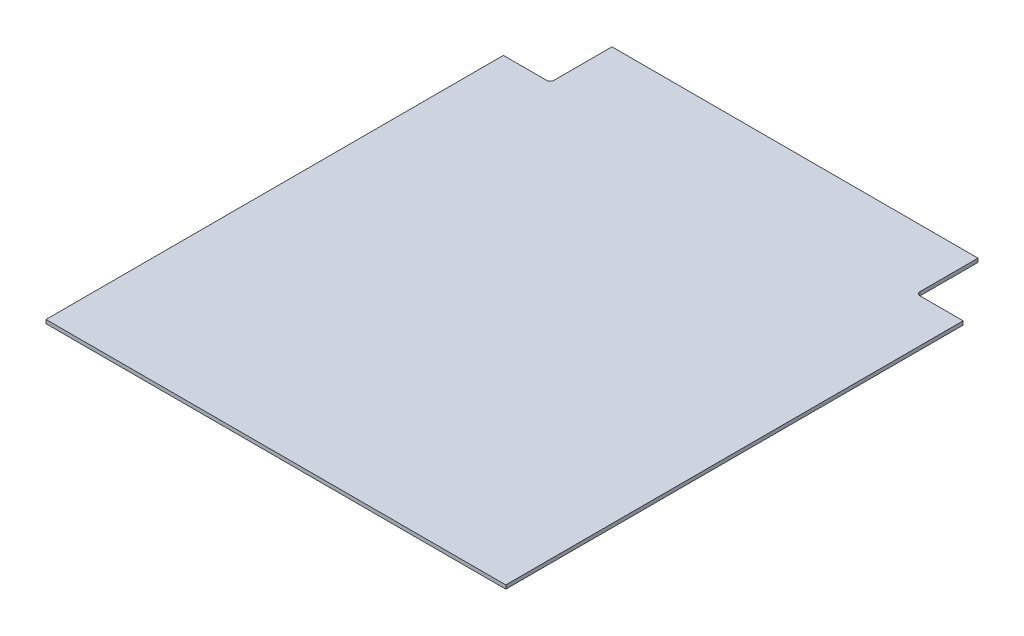
ISO-10303-21;
HEADER;
FILE_DESCRIPTION(('STEP AP214'),'2;1');
FILE_NAME('part.step','',(''),(''),'','','');
FILE_SCHEMA(('AUTOMOTIVE_DESIGN { 1 0 10303 214 1 1 1 1 }'));
ENDSEC;
DATA;
#1=APPLICATION_CONTEXT('core data for automotive mechanical design processes');
#2=APPLICATION_PROTOCOL_DEFINITION('international standard','automotive_design',2000,#1);
#3=PRODUCT_CONTEXT('',#1,'mechanical');
#4=PRODUCT('Part','Part','',(#3));
#5=PRODUCT_RELATED_PRODUCT_CATEGORY('part','',(#4));
#6=PRODUCT_DEFINITION_FORMATION('','',#4);
#7=PRODUCT_DEFINITION_CONTEXT('part definition',#1,'design');
#8=PRODUCT_DEFINITION('design','',#6,#7);
#9=PRODUCT_DEFINITION_SHAPE('','',#8);
#10=(LENGTH_UNIT() NAMED_UNIT(*) SI_UNIT(.MILLI.,.METRE.));
#11=(NAMED_UNIT(*) PLANE_ANGLE_UNIT() SI_UNIT($,.RADIAN.));
#12=(NAMED_UNIT(*) SI_UNIT($,.STERADIAN.) SOLID_ANGLE_UNIT());
#13=UNCERTAINTY_MEASURE_WITH_UNIT(LENGTH_MEASURE(1.E-05),#10,'distance_accuracy_value','');
#14=(GEOMETRIC_REPRESENTATION_CONTEXT(3) GLOBAL_UNCERTAINTY_ASSIGNED_CONTEXT((#13)) GLOBAL_UNIT_ASSIGNED_CONTEXT((#10,
#11,#12)) REPRESENTATION_CONTEXT('',''));
#15=CARTESIAN_POINT('',(0.,0.,0.));
#16=DIRECTION('',(0.,0.,1.));
#17=DIRECTION('',(1.,0.,0.));
#18=AXIS2_PLACEMENT_3D('',#15,#16,#17);
#19=CARTESIAN_POINT('',(-196.85,3.175,222.25));
#20=DIRECTION('',(1.,0.,0.));
#21=DIRECTION('',(0.,0.,-1.));
#22=AXIS2_PLACEMENT_3D('',#19,#20,#21);
#23=PLANE('',#22);
#24=DIRECTION('',(0.,0.,1.));
#25=VECTOR('',#24,1.);
#26=CARTESIAN_POINT('',(-196.85,3.175,222.25));
#27=LINE('',#26,#25);
#28=CARTESIAN_POINT('',(-196.85,3.175,-169.418));
#29=VERTEX_POINT('',#28);
#30=CARTESIAN_POINT('',(-196.85,3.175,222.25));
#31=VERTEX_POINT('',#30);
#32=EDGE_CURVE('E124',#29,#31,#27,.T.);
#33=ORIENTED_EDGE('',*,*,#32,.F.);
#34=DIRECTION('',(0.,1.,0.));
#35=VECTOR('',#34,1.);
#36=CARTESIAN_POINT('',(-196.85,-6.825,-169.418));
#37=LINE('',#36,#35);
#38=CARTESIAN_POINT('',(-196.85,0.,-169.418));
#39=VERTEX_POINT('',#38);
#40=EDGE_CURVE('E109',#39,#29,#37,.T.);
#41=ORIENTED_EDGE('',*,*,#40,.F.);
#42=DIRECTION('',(0.,0.,1.));
#43=VECTOR('',#42,1.);
#44=CARTESIAN_POINT('',(-196.85,0.,222.25));
#45=LINE('',#44,#43);
#46=CARTESIAN_POINT('',(-196.85,0.,222.25));
#47=VERTEX_POINT('',#46);
#48=EDGE_CURVE('E151',#39,#47,#45,.T.);
#49=ORIENTED_EDGE('',*,*,#48,.T.);
#50=DIRECTION('',(0.,-1.,0.));
#51=VECTOR('',#50,1.);
#52=CARTESIAN_POINT('',(-196.85,3.175,222.25));
#53=LINE('',#52,#51);
#54=EDGE_CURVE('E132',#31,#47,#53,.T.);
#55=ORIENTED_EDGE('',*,*,#54,.F.);
#56=EDGE_LOOP('',(#33,#41,#49,#55));
#57=FACE_BOUND('',#56,.T.);
#58=ADVANCED_FACE('F35',(#57),#23,.F.);
#59=CARTESIAN_POINT('',(196.85,3.175,222.25));
#60=DIRECTION('',(0.,0.,-1.));
#61=DIRECTION('',(-1.,0.,0.));
#62=AXIS2_PLACEMENT_3D('',#59,#60,#61);
#63=PLANE('',#62);
#64=DIRECTION('',(1.,0.,0.));
#65=VECTOR('',#64,1.);
#66=CARTESIAN_POINT('',(196.85,0.,222.25));
#67=LINE('',#66,#65);
#68=CARTESIAN_POINT('',(196.85,0.,222.25));
#69=VERTEX_POINT('',#68);
#70=EDGE_CURVE('E153',#47,#69,#67,.T.);
#71=ORIENTED_EDGE('',*,*,#70,.T.);
#72=DIRECTION('',(0.,-1.,0.));
#73=VECTOR('',#72,1.);
#74=CARTESIAN_POINT('',(196.85,3.175,222.25));
#75=LINE('',#74,#73);
#76=CARTESIAN_POINT('',(196.85,3.175,222.25));
#77=VERTEX_POINT('',#76);
#78=EDGE_CURVE('E150',#77,#69,#75,.T.);
#79=ORIENTED_EDGE('',*,*,#78,.F.);
#80=DIRECTION('',(1.,0.,0.));
#81=VECTOR('',#80,1.);
#82=CARTESIAN_POINT('',(196.85,3.175,222.25));
#83=LINE('',#82,#81);
#84=EDGE_CURVE('E133',#31,#77,#83,.T.);
#85=ORIENTED_EDGE('',*,*,#84,.F.);
#86=ORIENTED_EDGE('',*,*,#54,.T.);
#87=EDGE_LOOP('',(#71,#79,#85,#86));
#88=FACE_BOUND('',#87,.T.);
#89=ADVANCED_FACE('F216',(#88),#63,.F.);
#90=CARTESIAN_POINT('',(196.85,3.175,222.25));
#91=DIRECTION('',(-1.,0.,0.));
#92=DIRECTION('',(0.,0.,1.));
#93=AXIS2_PLACEMENT_3D('',#90,#91,#92);
#94=PLANE('',#93);
#95=DIRECTION('',(0.,0.,-1.));
#96=VECTOR('',#95,1.);
#97=CARTESIAN_POINT('',(196.85,0.,222.25));
#98=LINE('',#97,#96);
#99=CARTESIAN_POINT('',(196.85,0.,-169.418));
#100=VERTEX_POINT('',#99);
#101=EDGE_CURVE('E139',#69,#100,#98,.T.);
#102=ORIENTED_EDGE('',*,*,#101,.T.);
#103=DIRECTION('',(0.,1.,0.));
#104=VECTOR('',#103,1.);
#105=CARTESIAN_POINT('',(196.85,-6.825,-169.418));
#106=LINE('',#105,#104);
#107=CARTESIAN_POINT('',(196.85,3.175,-169.418));
#108=VERTEX_POINT('',#107);
#109=EDGE_CURVE('E128',#100,#108,#106,.T.);
#110=ORIENTED_EDGE('',*,*,#109,.T.);
#111=DIRECTION('',(0.,0.,-1.));
#112=VECTOR('',#111,1.);
#113=CARTESIAN_POINT('',(196.85,3.175,222.25));
#114=LINE('',#113,#112);
#115=EDGE_CURVE('E136',#77,#108,#114,.T.);
#116=ORIENTED_EDGE('',*,*,#115,.F.);
#117=ORIENTED_EDGE('',*,*,#78,.T.);
#118=EDGE_LOOP('',(#102,#110,#116,#117));
#119=FACE_BOUND('',#118,.T.);
#120=ADVANCED_FACE('F220',(#119),#94,.F.);
#121=CARTESIAN_POINT('',(196.85,3.175,-222.25));
#122=DIRECTION('',(0.,0.,1.));
#123=DIRECTION('',(1.,0.,0.));
#124=AXIS2_PLACEMENT_3D('',#121,#122,#123);
#125=PLANE('',#124);
#126=DIRECTION('',(-1.,0.,0.));
#127=VECTOR('',#126,1.);
#128=CARTESIAN_POINT('',(196.85,0.,-222.25));
#129=LINE('',#128,#127);
#130=CARTESIAN_POINT('',(156.718,0.,-222.25));
#131=VERTEX_POINT('',#130);
#132=CARTESIAN_POINT('',(-156.718,0.,-222.25));
#133=VERTEX_POINT('',#132);
#134=EDGE_CURVE('E134',#131,#133,#129,.T.);
#135=ORIENTED_EDGE('',*,*,#134,.T.);
#136=DIRECTION('',(0.,1.,0.));
#137=VECTOR('',#136,1.);
#138=CARTESIAN_POINT('',(-156.718,-6.825,-222.25));
#139=LINE('',#138,#137);
#140=CARTESIAN_POINT('',(-156.718,3.175,-222.25));
#141=VERTEX_POINT('',#140);
#142=EDGE_CURVE('E154',#133,#141,#139,.T.);
#143=ORIENTED_EDGE('',*,*,#142,.T.);
#144=DIRECTION('',(-1.,0.,0.));
#145=VECTOR('',#144,1.);
#146=CARTESIAN_POINT('',(196.85,3.175,-222.25));
#147=LINE('',#146,#145);
#148=CARTESIAN_POINT('',(156.718,3.175,-222.25));
#149=VERTEX_POINT('',#148);
#150=EDGE_CURVE('E147',#149,#141,#147,.T.);
#151=ORIENTED_EDGE('',*,*,#150,.F.);
#152=DIRECTION('',(0.,1.,0.));
#153=VECTOR('',#152,1.);
#154=CARTESIAN_POINT('',(156.718,-6.825,-222.25));
#155=LINE('',#154,#153);
#156=EDGE_CURVE('E142',#131,#149,#155,.T.);
#157=ORIENTED_EDGE('',*,*,#156,.F.);
#158=EDGE_LOOP('',(#135,#143,#151,#157));
#159=FACE_BOUND('',#158,.T.);
#160=ADVANCED_FACE('F203',(#159),#125,.F.);
#161=CARTESIAN_POINT('',(0.,3.175,0.));
#162=DIRECTION('',(0.,1.,0.));
#163=DIRECTION('',(0.,0.,1.));
#164=AXIS2_PLACEMENT_3D('',#161,#162,#163);
#165=PLANE('',#164);
#166=DIRECTION('',(0.,0.,-1.));
#167=VECTOR('',#166,1.);
#168=CARTESIAN_POINT('',(-156.718,3.175,-222.25));
#169=LINE('',#168,#167);
#170=CARTESIAN_POINT('',(-156.718,3.175,-172.593));
#171=VERTEX_POINT('',#170);
#172=EDGE_CURVE('E119',#171,#141,#169,.T.);
#173=ORIENTED_EDGE('',*,*,#172,.F.);
#174=CARTESIAN_POINT('',(-159.893,3.175,-172.593));
#175=DIRECTION('',(0.,1.,0.));
#176=DIRECTION('',(0.,0.,-1.));
#177=AXIS2_PLACEMENT_3D('',#174,#175,#176);
#178=CIRCLE('',#177,3.17500000000003);
#179=CARTESIAN_POINT('',(-159.893,3.175,-169.418));
#180=VERTEX_POINT('',#179);
#181=EDGE_CURVE('E127',#180,#171,#178,.T.);
#182=ORIENTED_EDGE('',*,*,#181,.F.);
#183=DIRECTION('',(1.,0.,0.));
#184=VECTOR('',#183,1.);
#185=CARTESIAN_POINT('',(-196.85,3.175,-169.418));
#186=LINE('',#185,#184);
#187=EDGE_CURVE('E112',#29,#180,#186,.T.);
#188=ORIENTED_EDGE('',*,*,#187,.F.);
#189=ORIENTED_EDGE('',*,*,#32,.T.);
#190=ORIENTED_EDGE('',*,*,#84,.T.);
#191=ORIENTED_EDGE('',*,*,#115,.T.);
#192=DIRECTION('',(1.,0.,0.));
#193=VECTOR('',#192,1.);
#194=CARTESIAN_POINT('',(196.85,3.175,-169.418));
#195=LINE('',#194,#193);
#196=CARTESIAN_POINT('',(159.893,3.175,-169.418));
#197=VERTEX_POINT('',#196);
#198=EDGE_CURVE('E190',#197,#108,#195,.T.);
#199=ORIENTED_EDGE('',*,*,#198,.F.);
#200=CARTESIAN_POINT('',(159.893,3.175,-172.593));
#201=DIRECTION('',(0.,1.,0.));
#202=DIRECTION('',(0.,0.,1.));
#203=AXIS2_PLACEMENT_3D('',#200,#201,#202);
#204=CIRCLE('',#203,3.175);
#205=CARTESIAN_POINT('',(156.718,3.175,-172.593));
#206=VERTEX_POINT('',#205);
#207=EDGE_CURVE('E187',#206,#197,#204,.T.);
#208=ORIENTED_EDGE('',*,*,#207,.F.);
#209=DIRECTION('',(0.,0.,1.));
#210=VECTOR('',#209,1.);
#211=CARTESIAN_POINT('',(156.718,3.175,-222.25));
#212=LINE('',#211,#210);
#213=EDGE_CURVE('E185',#149,#206,#212,.T.);
#214=ORIENTED_EDGE('',*,*,#213,.F.);
#215=ORIENTED_EDGE('',*,*,#150,.T.);
#216=EDGE_LOOP('',(#173,#182,#188,#189,#190,#191,#199,#208,#214,#215));
#217=FACE_BOUND('',#216,.T.);
#218=ADVANCED_FACE('F123',(#217),#165,.T.);
#219=CARTESIAN_POINT('',(0.,0.,0.));
#220=DIRECTION('',(0.,1.,0.));
#221=DIRECTION('',(0.,0.,1.));
#222=AXIS2_PLACEMENT_3D('',#219,#220,#221);
#223=PLANE('',#222);
#224=CARTESIAN_POINT('',(-159.893,0.,-172.593));
#225=DIRECTION('',(0.,1.,0.));
#226=DIRECTION('',(0.,0.,1.));
#227=AXIS2_PLACEMENT_3D('',#224,#225,#226);
#228=CIRCLE('',#227,3.17500000000003);
#229=CARTESIAN_POINT('',(-159.893,0.,-169.418));
#230=VERTEX_POINT('',#229);
#231=CARTESIAN_POINT('',(-156.718,0.,-172.593));
#232=VERTEX_POINT('',#231);
#233=EDGE_CURVE('E42',#230,#232,#228,.T.);
#234=ORIENTED_EDGE('',*,*,#233,.T.);
#235=DIRECTION('',(0.,0.,-1.));
#236=VECTOR('',#235,1.);
#237=CARTESIAN_POINT('',(-156.718,0.,0.));
#238=LINE('',#237,#236);
#239=EDGE_CURVE('E11',#232,#133,#238,.T.);
#240=ORIENTED_EDGE('',*,*,#239,.T.);
#241=ORIENTED_EDGE('',*,*,#134,.F.);
#242=DIRECTION('',(0.,0.,1.));
#243=VECTOR('',#242,1.);
#244=CARTESIAN_POINT('',(156.718,0.,0.));
#245=LINE('',#244,#243);
#246=CARTESIAN_POINT('',(156.718,0.,-172.593));
#247=VERTEX_POINT('',#246);
#248=EDGE_CURVE('E161',#131,#247,#245,.T.);
#249=ORIENTED_EDGE('',*,*,#248,.T.);
#250=CARTESIAN_POINT('',(159.893,0.,-172.593));
#251=DIRECTION('',(0.,1.,0.));
#252=DIRECTION('',(0.,0.,1.));
#253=AXIS2_PLACEMENT_3D('',#250,#251,#252);
#254=CIRCLE('',#253,3.175);
#255=CARTESIAN_POINT('',(159.893,0.,-169.418));
#256=VERTEX_POINT('',#255);
#257=EDGE_CURVE('E164',#247,#256,#254,.T.);
#258=ORIENTED_EDGE('',*,*,#257,.T.);
#259=DIRECTION('',(1.,0.,0.));
#260=VECTOR('',#259,1.);
#261=CARTESIAN_POINT('',(0.,0.,-169.418));
#262=LINE('',#261,#260);
#263=EDGE_CURVE('E167',#256,#100,#262,.T.);
#264=ORIENTED_EDGE('',*,*,#263,.T.);
#265=ORIENTED_EDGE('',*,*,#101,.F.);
#266=ORIENTED_EDGE('',*,*,#70,.F.);
#267=ORIENTED_EDGE('',*,*,#48,.F.);
#268=DIRECTION('',(1.,0.,0.));
#269=VECTOR('',#268,1.);
#270=CARTESIAN_POINT('',(0.,0.,-169.418));
#271=LINE('',#270,#269);
#272=EDGE_CURVE('E115',#39,#230,#271,.T.);
#273=ORIENTED_EDGE('',*,*,#272,.T.);
#274=EDGE_LOOP('',(#234,#240,#241,#249,#258,#264,#265,#266,#267,#273));
#275=FACE_BOUND('',#274,.T.);
#276=ADVANCED_FACE('F172',(#275),#223,.F.);
#277=CARTESIAN_POINT('',(196.85,-6.825,-169.418));
#278=DIRECTION('',(0.,0.,1.));
#279=DIRECTION('',(1.,0.,0.));
#280=AXIS2_PLACEMENT_3D('',#277,#278,#279);
#281=PLANE('',#280);
#282=DIRECTION('',(0.,1.,0.));
#283=VECTOR('',#282,1.);
#284=CARTESIAN_POINT('',(159.893,-6.825,-169.418));
#285=LINE('',#284,#283);
#286=EDGE_CURVE('E194',#256,#197,#285,.T.);
#287=ORIENTED_EDGE('',*,*,#286,.T.);
#288=ORIENTED_EDGE('',*,*,#198,.T.);
#289=ORIENTED_EDGE('',*,*,#109,.F.);
#290=ORIENTED_EDGE('',*,*,#263,.F.);
#291=EDGE_LOOP('',(#287,#288,#289,#290));
#292=FACE_BOUND('',#291,.T.);
#293=ADVANCED_FACE('F232',(#292),#281,.F.);
#294=CARTESIAN_POINT('',(159.893,-6.825,-172.593));
#295=DIRECTION('',(0.,1.,0.));
#296=DIRECTION('',(0.,0.,1.));
#297=AXIS2_PLACEMENT_3D('',#294,#295,#296);
#298=CYLINDRICAL_SURFACE('',#297,3.175);
#299=DIRECTION('',(0.,1.,0.));
#300=VECTOR('',#299,1.);
#301=CARTESIAN_POINT('',(156.718,-6.825,-172.593));
#302=LINE('',#301,#300);
#303=EDGE_CURVE('E57',#247,#206,#302,.T.);
#304=ORIENTED_EDGE('',*,*,#303,.T.);
#305=ORIENTED_EDGE('',*,*,#207,.T.);
#306=ORIENTED_EDGE('',*,*,#286,.F.);
#307=ORIENTED_EDGE('',*,*,#257,.F.);
#308=EDGE_LOOP('',(#304,#305,#306,#307));
#309=FACE_BOUND('',#308,.T.);
#310=ADVANCED_FACE('F213',(#309),#298,.F.);
#311=CARTESIAN_POINT('',(156.718,-6.825,-222.25));
#312=DIRECTION('',(-1.,0.,0.));
#313=DIRECTION('',(0.,0.,1.));
#314=AXIS2_PLACEMENT_3D('',#311,#312,#313);
#315=PLANE('',#314);
#316=ORIENTED_EDGE('',*,*,#156,.T.);
#317=ORIENTED_EDGE('',*,*,#213,.T.);
#318=ORIENTED_EDGE('',*,*,#303,.F.);
#319=ORIENTED_EDGE('',*,*,#248,.F.);
#320=EDGE_LOOP('',(#316,#317,#318,#319));
#321=FACE_BOUND('',#320,.T.);
#322=ADVANCED_FACE('F198',(#321),#315,.F.);
#323=CARTESIAN_POINT('',(-156.718,-6.825,-222.25));
#324=DIRECTION('',(1.,0.,0.));
#325=DIRECTION('',(0.,0.,-1.));
#326=AXIS2_PLACEMENT_3D('',#323,#324,#325);
#327=PLANE('',#326);
#328=DIRECTION('',(0.,1.,0.));
#329=VECTOR('',#328,1.);
#330=CARTESIAN_POINT('',(-156.718,-6.825,-172.593));
#331=LINE('',#330,#329);
#332=EDGE_CURVE('E177',#232,#171,#331,.T.);
#333=ORIENTED_EDGE('',*,*,#332,.T.);
#334=ORIENTED_EDGE('',*,*,#172,.T.);
#335=ORIENTED_EDGE('',*,*,#142,.F.);
#336=ORIENTED_EDGE('',*,*,#239,.F.);
#337=EDGE_LOOP('',(#333,#334,#335,#336));
#338=FACE_BOUND('',#337,.T.);
#339=ADVANCED_FACE('F204',(#338),#327,.F.);
#340=CARTESIAN_POINT('',(-159.893,-6.825,-172.593));
#341=DIRECTION('',(0.,1.,0.));
#342=DIRECTION('',(0.,0.,1.));
#343=AXIS2_PLACEMENT_3D('',#340,#341,#342);
#344=CYLINDRICAL_SURFACE('',#343,3.17500000000003);
#345=DIRECTION('',(0.,1.,0.));
#346=VECTOR('',#345,1.);
#347=CARTESIAN_POINT('',(-159.893,-6.825,-169.418));
#348=LINE('',#347,#346);
#349=EDGE_CURVE('E49',#230,#180,#348,.T.);
#350=ORIENTED_EDGE('',*,*,#349,.T.);
#351=ORIENTED_EDGE('',*,*,#181,.T.);
#352=ORIENTED_EDGE('',*,*,#332,.F.);
#353=ORIENTED_EDGE('',*,*,#233,.F.);
#354=EDGE_LOOP('',(#350,#351,#352,#353));
#355=FACE_BOUND('',#354,.T.);
#356=ADVANCED_FACE('F176',(#355),#344,.F.);
#357=CARTESIAN_POINT('',(-196.85,-6.825,-169.418));
#358=DIRECTION('',(0.,0.,1.));
#359=DIRECTION('',(1.,0.,0.));
#360=AXIS2_PLACEMENT_3D('',#357,#358,#359);
#361=PLANE('',#360);
#362=ORIENTED_EDGE('',*,*,#40,.T.);
#363=ORIENTED_EDGE('',*,*,#187,.T.);
#364=ORIENTED_EDGE('',*,*,#349,.F.);
#365=ORIENTED_EDGE('',*,*,#272,.F.);
#366=EDGE_LOOP('',(#362,#363,#364,#365));
#367=FACE_BOUND('',#366,.T.);
#368=ADVANCED_FACE('F111',(#367),#361,.F.);
#369=CLOSED_SHELL('',(#58,#89,#120,#160,#218,#276,#293,#310,#322,#339,#356,#368));
#370=MANIFOLD_SOLID_BREP('B2',#369);
#371=ADVANCED_BREP_SHAPE_REPRESENTATION('',(#18,#370),#14);
#372=SHAPE_DEFINITION_REPRESENTATION(#9,#371);
ENDSEC;
END-ISO-10303-21;
